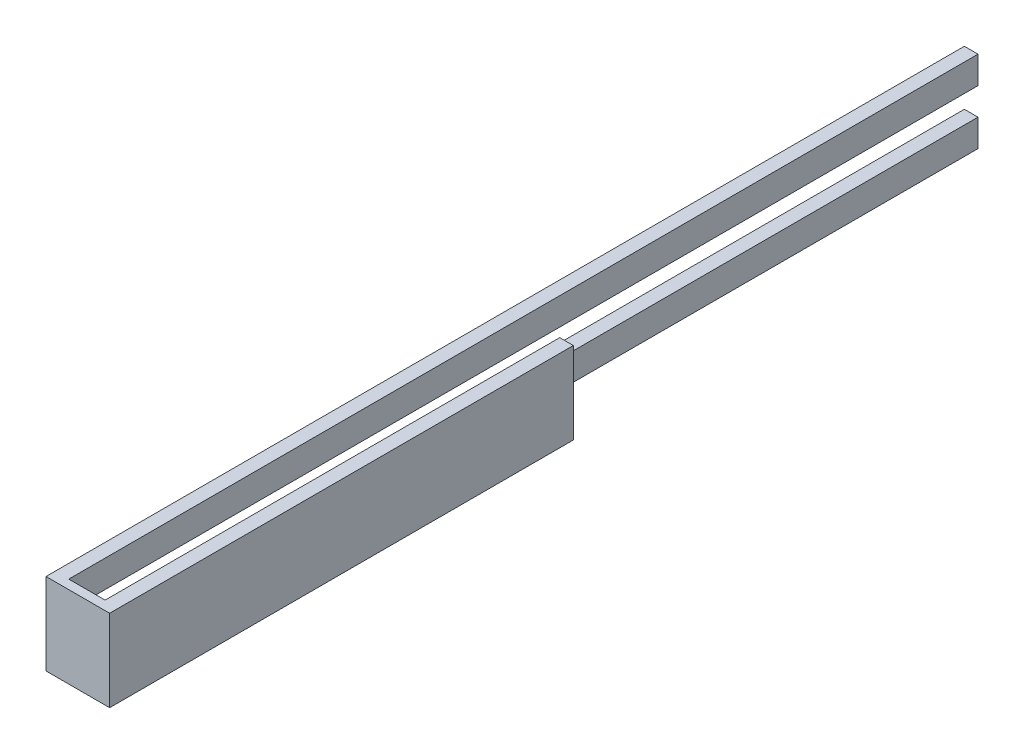
ISO-10303-21;
HEADER;
FILE_DESCRIPTION(('STEP AP214'),'2;1');
FILE_NAME('part.step','',(''),(''),'','','');
FILE_SCHEMA(('AUTOMOTIVE_DESIGN { 1 0 10303 214 1 1 1 1 }'));
ENDSEC;
DATA;
#1=APPLICATION_CONTEXT('core data for automotive mechanical design processes');
#2=APPLICATION_PROTOCOL_DEFINITION('international standard','automotive_design',2000,#1);
#3=PRODUCT_CONTEXT('',#1,'mechanical');
#4=PRODUCT('Part','Part','',(#3));
#5=PRODUCT_RELATED_PRODUCT_CATEGORY('part','',(#4));
#6=PRODUCT_DEFINITION_FORMATION('','',#4);
#7=PRODUCT_DEFINITION_CONTEXT('part definition',#1,'design');
#8=PRODUCT_DEFINITION('design','',#6,#7);
#9=PRODUCT_DEFINITION_SHAPE('','',#8);
#10=(LENGTH_UNIT() NAMED_UNIT(*) SI_UNIT(.MILLI.,.METRE.));
#11=(NAMED_UNIT(*) PLANE_ANGLE_UNIT() SI_UNIT($,.RADIAN.));
#12=(NAMED_UNIT(*) SI_UNIT($,.STERADIAN.) SOLID_ANGLE_UNIT());
#13=UNCERTAINTY_MEASURE_WITH_UNIT(LENGTH_MEASURE(1.E-05),#10,'distance_accuracy_value','');
#14=(GEOMETRIC_REPRESENTATION_CONTEXT(3) GLOBAL_UNCERTAINTY_ASSIGNED_CONTEXT((#13)) GLOBAL_UNIT_ASSIGNED_CONTEXT((#10,
#11,#12)) REPRESENTATION_CONTEXT('',''));
#15=CARTESIAN_POINT('',(0.,0.,0.));
#16=DIRECTION('',(0.,0.,1.));
#17=DIRECTION('',(1.,0.,0.));
#18=AXIS2_PLACEMENT_3D('',#15,#16,#17);
#19=CARTESIAN_POINT('',(0.,0.,0.));
#20=DIRECTION('',(0.,0.,-1.));
#21=DIRECTION('',(-1.,0.,0.));
#22=AXIS2_PLACEMENT_3D('',#19,#20,#21);
#23=PLANE('',#22);
#24=DIRECTION('',(-1.,0.,0.));
#25=VECTOR('',#24,1.);
#26=CARTESIAN_POINT('',(0.,9.,0.));
#27=LINE('',#26,#25);
#28=CARTESIAN_POINT('',(5.,9.,0.));
#29=VERTEX_POINT('',#28);
#30=CARTESIAN_POINT('',(1.,9.,0.));
#31=VERTEX_POINT('',#30);
#32=EDGE_CURVE('E37',#29,#31,#27,.T.);
#33=ORIENTED_EDGE('',*,*,#32,.F.);
#34=DIRECTION('',(0.,1.,0.));
#35=VECTOR('',#34,1.);
#36=CARTESIAN_POINT('',(5.,9.,0.));
#37=LINE('',#36,#35);
#38=CARTESIAN_POINT('',(5.,0.,0.));
#39=VERTEX_POINT('',#38);
#40=EDGE_CURVE('E169',#39,#29,#37,.T.);
#41=ORIENTED_EDGE('',*,*,#40,.F.);
#42=DIRECTION('',(1.,0.,0.));
#43=VECTOR('',#42,1.);
#44=CARTESIAN_POINT('',(0.,0.,0.));
#45=LINE('',#44,#43);
#46=CARTESIAN_POINT('',(1.,0.,0.));
#47=VERTEX_POINT('',#46);
#48=EDGE_CURVE('E214',#47,#39,#45,.T.);
#49=ORIENTED_EDGE('',*,*,#48,.F.);
#50=DIRECTION('',(0.,1.,0.));
#51=VECTOR('',#50,1.);
#52=CARTESIAN_POINT('',(1.,0.,0.));
#53=LINE('',#52,#51);
#54=CARTESIAN_POINT('',(1.,3.,0.));
#55=VERTEX_POINT('',#54);
#56=EDGE_CURVE('E200',#47,#55,#53,.T.);
#57=ORIENTED_EDGE('',*,*,#56,.T.);
#58=DIRECTION('',(1.,0.,0.));
#59=VECTOR('',#58,1.);
#60=CARTESIAN_POINT('',(0.,3.,0.));
#61=LINE('',#60,#59);
#62=CARTESIAN_POINT('',(-0.5,3.,0.));
#63=VERTEX_POINT('',#62);
#64=EDGE_CURVE('E191',#63,#55,#61,.T.);
#65=ORIENTED_EDGE('',*,*,#64,.F.);
#66=DIRECTION('',(0.,-1.,0.));
#67=VECTOR('',#66,1.);
#68=CARTESIAN_POINT('',(-0.5,6.,0.));
#69=LINE('',#68,#67);
#70=CARTESIAN_POINT('',(-0.5,6.,0.));
#71=VERTEX_POINT('',#70);
#72=EDGE_CURVE('E151',#71,#63,#69,.T.);
#73=ORIENTED_EDGE('',*,*,#72,.F.);
#74=DIRECTION('',(1.,0.,0.));
#75=VECTOR('',#74,1.);
#76=CARTESIAN_POINT('',(0.,6.,0.));
#77=LINE('',#76,#75);
#78=CARTESIAN_POINT('',(1.,6.,0.));
#79=VERTEX_POINT('',#78);
#80=EDGE_CURVE('E187',#71,#79,#77,.T.);
#81=ORIENTED_EDGE('',*,*,#80,.T.);
#82=DIRECTION('',(0.,-1.,0.));
#83=VECTOR('',#82,1.);
#84=CARTESIAN_POINT('',(1.,9.,0.));
#85=LINE('',#84,#83);
#86=EDGE_CURVE('E184',#31,#79,#85,.T.);
#87=ORIENTED_EDGE('',*,*,#86,.F.);
#88=EDGE_LOOP('',(#33,#41,#49,#57,#65,#73,#81,#87));
#89=FACE_BOUND('',#88,.T.);
#90=ADVANCED_FACE('F33',(#89),#23,.T.);
#91=CARTESIAN_POINT('',(0.,0.,0.999999999999998));
#92=DIRECTION('',(0.,1.,0.));
#93=DIRECTION('',(0.,0.,1.));
#94=AXIS2_PLACEMENT_3D('',#91,#92,#93);
#95=PLANE('',#94);
#96=DIRECTION('',(1.,0.,0.));
#97=VECTOR('',#96,1.);
#98=CARTESIAN_POINT('',(0.,0.,0.999999999999998));
#99=LINE('',#98,#97);
#100=CARTESIAN_POINT('',(-0.5,0.,0.999999999999998));
#101=VERTEX_POINT('',#100);
#102=CARTESIAN_POINT('',(6.5,0.,0.999999999999998));
#103=VERTEX_POINT('',#102);
#104=EDGE_CURVE('E42',#101,#103,#99,.T.);
#105=ORIENTED_EDGE('',*,*,#104,.F.);
#106=DIRECTION('',(0.,0.,1.));
#107=VECTOR('',#106,1.);
#108=CARTESIAN_POINT('',(-0.5,0.,-100.));
#109=LINE('',#108,#107);
#110=CARTESIAN_POINT('',(-0.5,0.,-100.));
#111=VERTEX_POINT('',#110);
#112=EDGE_CURVE('E144',#111,#101,#109,.T.);
#113=ORIENTED_EDGE('',*,*,#112,.F.);
#114=DIRECTION('',(1.,0.,0.));
#115=VECTOR('',#114,1.);
#116=CARTESIAN_POINT('',(0.,0.,-100.));
#117=LINE('',#116,#115);
#118=CARTESIAN_POINT('',(1.,0.,-100.));
#119=VERTEX_POINT('',#118);
#120=EDGE_CURVE('E203',#111,#119,#117,.T.);
#121=ORIENTED_EDGE('',*,*,#120,.T.);
#122=DIRECTION('',(0.,0.,1.));
#123=VECTOR('',#122,1.);
#124=CARTESIAN_POINT('',(1.,0.,-100.));
#125=LINE('',#124,#123);
#126=EDGE_CURVE('E206',#119,#47,#125,.T.);
#127=ORIENTED_EDGE('',*,*,#126,.T.);
#128=ORIENTED_EDGE('',*,*,#48,.T.);
#129=DIRECTION('',(0.,0.,1.));
#130=VECTOR('',#129,1.);
#131=CARTESIAN_POINT('',(5.,0.,-50.));
#132=LINE('',#131,#130);
#133=CARTESIAN_POINT('',(5.,0.,-50.));
#134=VERTEX_POINT('',#133);
#135=EDGE_CURVE('E178',#134,#39,#132,.T.);
#136=ORIENTED_EDGE('',*,*,#135,.F.);
#137=DIRECTION('',(-1.,0.,0.));
#138=VECTOR('',#137,1.);
#139=CARTESIAN_POINT('',(6.,0.,-50.));
#140=LINE('',#139,#138);
#141=CARTESIAN_POINT('',(6.5,0.,-50.));
#142=VERTEX_POINT('',#141);
#143=EDGE_CURVE('E170',#142,#134,#140,.T.);
#144=ORIENTED_EDGE('',*,*,#143,.F.);
#145=DIRECTION('',(0.,0.,-1.));
#146=VECTOR('',#145,1.);
#147=CARTESIAN_POINT('',(6.5,0.,0.999999999999998));
#148=LINE('',#147,#146);
#149=EDGE_CURVE('E161',#103,#142,#148,.T.);
#150=ORIENTED_EDGE('',*,*,#149,.F.);
#151=EDGE_LOOP('',(#105,#113,#121,#127,#128,#136,#144,#150));
#152=FACE_BOUND('',#151,.T.);
#153=ADVANCED_FACE('F35',(#152),#95,.F.);
#154=CARTESIAN_POINT('',(0.,9.,0.999999999999998));
#155=DIRECTION('',(0.,-1.,0.));
#156=DIRECTION('',(0.,0.,-1.));
#157=AXIS2_PLACEMENT_3D('',#154,#155,#156);
#158=PLANE('',#157);
#159=DIRECTION('',(-1.,0.,0.));
#160=VECTOR('',#159,1.);
#161=CARTESIAN_POINT('',(0.,9.,0.999999999999998));
#162=LINE('',#161,#160);
#163=CARTESIAN_POINT('',(6.5,9.,0.999999999999998));
#164=VERTEX_POINT('',#163);
#165=CARTESIAN_POINT('',(-0.5,9.,0.999999999999998));
#166=VERTEX_POINT('',#165);
#167=EDGE_CURVE('E11',#164,#166,#162,.T.);
#168=ORIENTED_EDGE('',*,*,#167,.F.);
#169=DIRECTION('',(0.,0.,1.));
#170=VECTOR('',#169,1.);
#171=CARTESIAN_POINT('',(6.5,9.,-50.));
#172=LINE('',#171,#170);
#173=CARTESIAN_POINT('',(6.5,9.,-50.));
#174=VERTEX_POINT('',#173);
#175=EDGE_CURVE('E167',#174,#164,#172,.T.);
#176=ORIENTED_EDGE('',*,*,#175,.F.);
#177=DIRECTION('',(1.,0.,0.));
#178=VECTOR('',#177,1.);
#179=CARTESIAN_POINT('',(6.,9.,-50.));
#180=LINE('',#179,#178);
#181=CARTESIAN_POINT('',(5.,9.,-50.));
#182=VERTEX_POINT('',#181);
#183=EDGE_CURVE('E174',#182,#174,#180,.T.);
#184=ORIENTED_EDGE('',*,*,#183,.F.);
#185=DIRECTION('',(0.,0.,1.));
#186=VECTOR('',#185,1.);
#187=CARTESIAN_POINT('',(5.,9.,-50.));
#188=LINE('',#187,#186);
#189=EDGE_CURVE('E50',#182,#29,#188,.T.);
#190=ORIENTED_EDGE('',*,*,#189,.T.);
#191=ORIENTED_EDGE('',*,*,#32,.T.);
#192=DIRECTION('',(0.,0.,1.));
#193=VECTOR('',#192,1.);
#194=CARTESIAN_POINT('',(1.,9.,-100.));
#195=LINE('',#194,#193);
#196=CARTESIAN_POINT('',(1.,9.,-100.));
#197=VERTEX_POINT('',#196);
#198=EDGE_CURVE('E180',#197,#31,#195,.T.);
#199=ORIENTED_EDGE('',*,*,#198,.F.);
#200=DIRECTION('',(1.,0.,0.));
#201=VECTOR('',#200,1.);
#202=CARTESIAN_POINT('',(0.,9.,-100.));
#203=LINE('',#202,#201);
#204=CARTESIAN_POINT('',(-0.5,9.,-100.));
#205=VERTEX_POINT('',#204);
#206=EDGE_CURVE('E134',#205,#197,#203,.T.);
#207=ORIENTED_EDGE('',*,*,#206,.F.);
#208=DIRECTION('',(0.,0.,-1.));
#209=VECTOR('',#208,1.);
#210=CARTESIAN_POINT('',(-0.5,9.,0.999999999999998));
#211=LINE('',#210,#209);
#212=EDGE_CURVE('E132',#166,#205,#211,.T.);
#213=ORIENTED_EDGE('',*,*,#212,.F.);
#214=EDGE_LOOP('',(#168,#176,#184,#190,#191,#199,#207,#213));
#215=FACE_BOUND('',#214,.T.);
#216=ADVANCED_FACE('F133',(#215),#158,.F.);
#217=CARTESIAN_POINT('',(0.,0.,0.999999999999998));
#218=DIRECTION('',(0.,0.,-1.));
#219=DIRECTION('',(-1.,0.,0.));
#220=AXIS2_PLACEMENT_3D('',#217,#218,#219);
#221=PLANE('',#220);
#222=ORIENTED_EDGE('',*,*,#167,.T.);
#223=DIRECTION('',(0.,1.,0.));
#224=VECTOR('',#223,1.);
#225=CARTESIAN_POINT('',(-0.5,0.,0.999999999999998));
#226=LINE('',#225,#224);
#227=EDGE_CURVE('E126',#101,#166,#226,.T.);
#228=ORIENTED_EDGE('',*,*,#227,.F.);
#229=ORIENTED_EDGE('',*,*,#104,.T.);
#230=DIRECTION('',(0.,-1.,0.));
#231=VECTOR('',#230,1.);
#232=CARTESIAN_POINT('',(6.5,9.,0.999999999999998));
#233=LINE('',#232,#231);
#234=EDGE_CURVE('E128',#164,#103,#233,.T.);
#235=ORIENTED_EDGE('',*,*,#234,.F.);
#236=EDGE_LOOP('',(#222,#228,#229,#235));
#237=FACE_BOUND('',#236,.T.);
#238=ADVANCED_FACE('F124',(#237),#221,.F.);
#239=CARTESIAN_POINT('',(0.,3.,-100.));
#240=DIRECTION('',(0.,-1.,0.));
#241=DIRECTION('',(0.,0.,-1.));
#242=AXIS2_PLACEMENT_3D('',#239,#240,#241);
#243=PLANE('',#242);
#244=ORIENTED_EDGE('',*,*,#64,.T.);
#245=DIRECTION('',(0.,0.,1.));
#246=VECTOR('',#245,1.);
#247=CARTESIAN_POINT('',(1.,3.,-100.));
#248=LINE('',#247,#246);
#249=CARTESIAN_POINT('',(1.,3.,-100.));
#250=VERTEX_POINT('',#249);
#251=EDGE_CURVE('E211',#250,#55,#248,.T.);
#252=ORIENTED_EDGE('',*,*,#251,.F.);
#253=DIRECTION('',(1.,0.,0.));
#254=VECTOR('',#253,1.);
#255=CARTESIAN_POINT('',(0.,3.,-100.));
#256=LINE('',#255,#254);
#257=CARTESIAN_POINT('',(-0.5,3.,-100.));
#258=VERTEX_POINT('',#257);
#259=EDGE_CURVE('E197',#258,#250,#256,.T.);
#260=ORIENTED_EDGE('',*,*,#259,.F.);
#261=DIRECTION('',(0.,0.,-1.));
#262=VECTOR('',#261,1.);
#263=CARTESIAN_POINT('',(-0.5,3.,0.));
#264=LINE('',#263,#262);
#265=EDGE_CURVE('E154',#63,#258,#264,.T.);
#266=ORIENTED_EDGE('',*,*,#265,.F.);
#267=EDGE_LOOP('',(#244,#252,#260,#266));
#268=FACE_BOUND('',#267,.T.);
#269=ADVANCED_FACE('F251',(#268),#243,.F.);
#270=CARTESIAN_POINT('',(1.,0.,-100.));
#271=DIRECTION('',(1.,0.,0.));
#272=DIRECTION('',(0.,0.,-1.));
#273=AXIS2_PLACEMENT_3D('',#270,#271,#272);
#274=PLANE('',#273);
#275=ORIENTED_EDGE('',*,*,#56,.F.);
#276=ORIENTED_EDGE('',*,*,#126,.F.);
#277=DIRECTION('',(0.,1.,0.));
#278=VECTOR('',#277,1.);
#279=CARTESIAN_POINT('',(1.,0.,-100.));
#280=LINE('',#279,#278);
#281=EDGE_CURVE('E199',#119,#250,#280,.T.);
#282=ORIENTED_EDGE('',*,*,#281,.T.);
#283=ORIENTED_EDGE('',*,*,#251,.T.);
#284=EDGE_LOOP('',(#275,#276,#282,#283));
#285=FACE_BOUND('',#284,.T.);
#286=ADVANCED_FACE('F255',(#285),#274,.T.);
#287=CARTESIAN_POINT('',(0.,0.,-100.));
#288=DIRECTION('',(0.,0.,1.));
#289=DIRECTION('',(1.,0.,0.));
#290=AXIS2_PLACEMENT_3D('',#287,#288,#289);
#291=PLANE('',#290);
#292=ORIENTED_EDGE('',*,*,#259,.T.);
#293=ORIENTED_EDGE('',*,*,#281,.F.);
#294=ORIENTED_EDGE('',*,*,#120,.F.);
#295=DIRECTION('',(0.,-1.,0.));
#296=VECTOR('',#295,1.);
#297=CARTESIAN_POINT('',(-0.5,3.,-100.));
#298=LINE('',#297,#296);
#299=EDGE_CURVE('E157',#258,#111,#298,.T.);
#300=ORIENTED_EDGE('',*,*,#299,.F.);
#301=EDGE_LOOP('',(#292,#293,#294,#300));
#302=FACE_BOUND('',#301,.T.);
#303=ADVANCED_FACE('F260',(#302),#291,.F.);
#304=CARTESIAN_POINT('',(0.,6.,-100.));
#305=DIRECTION('',(0.,-1.,0.));
#306=DIRECTION('',(0.,0.,-1.));
#307=AXIS2_PLACEMENT_3D('',#304,#305,#306);
#308=PLANE('',#307);
#309=ORIENTED_EDGE('',*,*,#80,.F.);
#310=DIRECTION('',(0.,0.,1.));
#311=VECTOR('',#310,1.);
#312=CARTESIAN_POINT('',(-0.5,6.,-100.));
#313=LINE('',#312,#311);
#314=CARTESIAN_POINT('',(-0.5,6.,-100.));
#315=VERTEX_POINT('',#314);
#316=EDGE_CURVE('E148',#315,#71,#313,.T.);
#317=ORIENTED_EDGE('',*,*,#316,.F.);
#318=DIRECTION('',(1.,0.,0.));
#319=VECTOR('',#318,1.);
#320=CARTESIAN_POINT('',(0.,6.,-100.));
#321=LINE('',#320,#319);
#322=CARTESIAN_POINT('',(1.,6.,-100.));
#323=VERTEX_POINT('',#322);
#324=EDGE_CURVE('E188',#315,#323,#321,.T.);
#325=ORIENTED_EDGE('',*,*,#324,.T.);
#326=DIRECTION('',(0.,0.,1.));
#327=VECTOR('',#326,1.);
#328=CARTESIAN_POINT('',(1.,6.,-100.));
#329=LINE('',#328,#327);
#330=EDGE_CURVE('E181',#323,#79,#329,.T.);
#331=ORIENTED_EDGE('',*,*,#330,.T.);
#332=EDGE_LOOP('',(#309,#317,#325,#331));
#333=FACE_BOUND('',#332,.T.);
#334=ADVANCED_FACE('F266',(#333),#308,.T.);
#335=CARTESIAN_POINT('',(1.,9.,-100.));
#336=DIRECTION('',(-1.,0.,0.));
#337=DIRECTION('',(0.,-1.,0.));
#338=AXIS2_PLACEMENT_3D('',#335,#336,#337);
#339=PLANE('',#338);
#340=ORIENTED_EDGE('',*,*,#86,.T.);
#341=ORIENTED_EDGE('',*,*,#330,.F.);
#342=DIRECTION('',(0.,-1.,0.));
#343=VECTOR('',#342,1.);
#344=CARTESIAN_POINT('',(1.,9.,-100.));
#345=LINE('',#344,#343);
#346=EDGE_CURVE('E193',#197,#323,#345,.T.);
#347=ORIENTED_EDGE('',*,*,#346,.F.);
#348=ORIENTED_EDGE('',*,*,#198,.T.);
#349=EDGE_LOOP('',(#340,#341,#347,#348));
#350=FACE_BOUND('',#349,.T.);
#351=ADVANCED_FACE('F271',(#350),#339,.F.);
#352=CARTESIAN_POINT('',(0.,0.,-100.));
#353=DIRECTION('',(0.,0.,-1.));
#354=DIRECTION('',(-1.,0.,0.));
#355=AXIS2_PLACEMENT_3D('',#352,#353,#354);
#356=PLANE('',#355);
#357=ORIENTED_EDGE('',*,*,#324,.F.);
#358=DIRECTION('',(0.,-1.,0.));
#359=VECTOR('',#358,1.);
#360=CARTESIAN_POINT('',(-0.5,9.,-100.));
#361=LINE('',#360,#359);
#362=EDGE_CURVE('E138',#205,#315,#361,.T.);
#363=ORIENTED_EDGE('',*,*,#362,.F.);
#364=ORIENTED_EDGE('',*,*,#206,.T.);
#365=ORIENTED_EDGE('',*,*,#346,.T.);
#366=EDGE_LOOP('',(#357,#363,#364,#365));
#367=FACE_BOUND('',#366,.T.);
#368=ADVANCED_FACE('F268',(#367),#356,.T.);
#369=CARTESIAN_POINT('',(5.,9.,-50.));
#370=DIRECTION('',(1.,0.,0.));
#371=DIRECTION('',(0.,1.,0.));
#372=AXIS2_PLACEMENT_3D('',#369,#370,#371);
#373=PLANE('',#372);
#374=ORIENTED_EDGE('',*,*,#40,.T.);
#375=ORIENTED_EDGE('',*,*,#189,.F.);
#376=DIRECTION('',(0.,1.,0.));
#377=VECTOR('',#376,1.);
#378=CARTESIAN_POINT('',(5.,9.,-50.));
#379=LINE('',#378,#377);
#380=EDGE_CURVE('E172',#134,#182,#379,.T.);
#381=ORIENTED_EDGE('',*,*,#380,.F.);
#382=ORIENTED_EDGE('',*,*,#135,.T.);
#383=EDGE_LOOP('',(#374,#375,#381,#382));
#384=FACE_BOUND('',#383,.T.);
#385=ADVANCED_FACE('F225',(#384),#373,.F.);
#386=CARTESIAN_POINT('',(0.,0.,-50.));
#387=DIRECTION('',(0.,0.,-1.));
#388=DIRECTION('',(-1.,0.,0.));
#389=AXIS2_PLACEMENT_3D('',#386,#387,#388);
#390=PLANE('',#389);
#391=ORIENTED_EDGE('',*,*,#183,.T.);
#392=DIRECTION('',(0.,1.,0.));
#393=VECTOR('',#392,1.);
#394=CARTESIAN_POINT('',(6.5,0.,-50.));
#395=LINE('',#394,#393);
#396=EDGE_CURVE('E164',#142,#174,#395,.T.);
#397=ORIENTED_EDGE('',*,*,#396,.F.);
#398=ORIENTED_EDGE('',*,*,#143,.T.);
#399=ORIENTED_EDGE('',*,*,#380,.T.);
#400=EDGE_LOOP('',(#391,#397,#398,#399));
#401=FACE_BOUND('',#400,.T.);
#402=ADVANCED_FACE('F227',(#401),#390,.T.);
#403=CARTESIAN_POINT('',(6.5,0.,0.));
#404=DIRECTION('',(1.,0.,0.));
#405=DIRECTION('',(0.,0.,-1.));
#406=AXIS2_PLACEMENT_3D('',#403,#404,#405);
#407=PLANE('',#406);
#408=ORIENTED_EDGE('',*,*,#234,.T.);
#409=ORIENTED_EDGE('',*,*,#149,.T.);
#410=ORIENTED_EDGE('',*,*,#396,.T.);
#411=ORIENTED_EDGE('',*,*,#175,.T.);
#412=EDGE_LOOP('',(#408,#409,#410,#411));
#413=FACE_BOUND('',#412,.T.);
#414=ADVANCED_FACE('F231',(#413),#407,.T.);
#415=CARTESIAN_POINT('',(-0.5,0.,0.));
#416=DIRECTION('',(-1.,0.,0.));
#417=DIRECTION('',(0.,0.,1.));
#418=AXIS2_PLACEMENT_3D('',#415,#416,#417);
#419=PLANE('',#418);
#420=ORIENTED_EDGE('',*,*,#227,.T.);
#421=ORIENTED_EDGE('',*,*,#212,.T.);
#422=ORIENTED_EDGE('',*,*,#362,.T.);
#423=ORIENTED_EDGE('',*,*,#316,.T.);
#424=ORIENTED_EDGE('',*,*,#72,.T.);
#425=ORIENTED_EDGE('',*,*,#265,.T.);
#426=ORIENTED_EDGE('',*,*,#299,.T.);
#427=ORIENTED_EDGE('',*,*,#112,.T.);
#428=EDGE_LOOP('',(#420,#421,#422,#423,#424,#425,#426,#427));
#429=FACE_BOUND('',#428,.T.);
#430=ADVANCED_FACE('F141',(#429),#419,.T.);
#431=CLOSED_SHELL('',(#90,#153,#216,#238,#269,#286,#303,#334,#351,#368,#385,#402,#414,#430));
#432=MANIFOLD_SOLID_BREP('B2',#431);
#433=ADVANCED_BREP_SHAPE_REPRESENTATION('',(#18,#432),#14);
#434=SHAPE_DEFINITION_REPRESENTATION(#9,#433);
ENDSEC;
END-ISO-10303-21;
